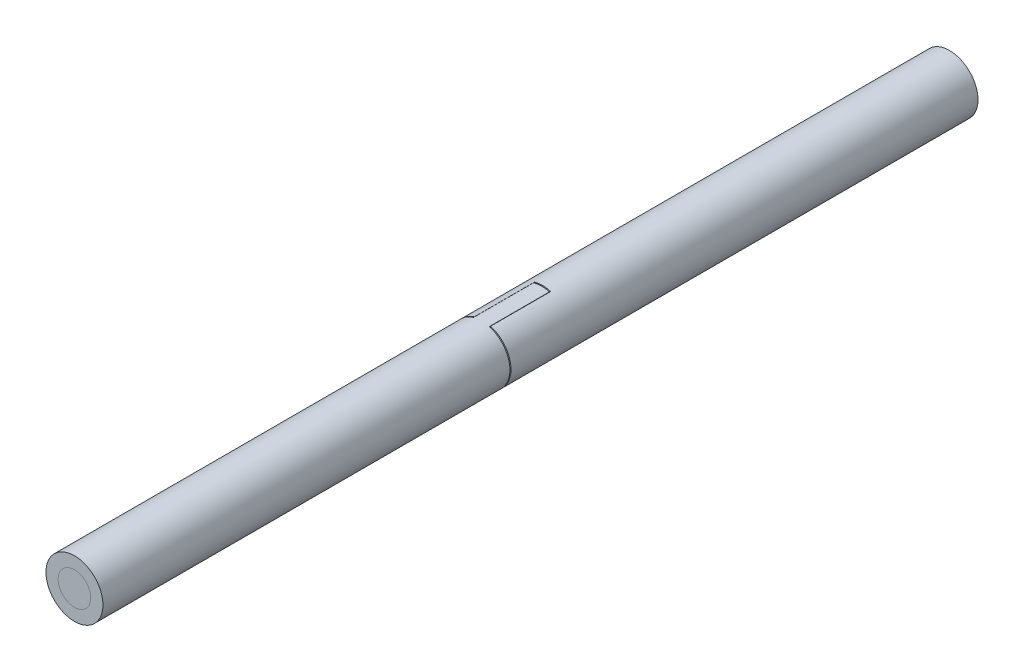
ISO-10303-21;
HEADER;
FILE_DESCRIPTION(('STEP AP214'),'2;1');
FILE_NAME('part.step','',(''),(''),'','','');
FILE_SCHEMA(('AUTOMOTIVE_DESIGN { 1 0 10303 214 1 1 1 1 }'));
ENDSEC;
DATA;
#1=APPLICATION_CONTEXT('core data for automotive mechanical design processes');
#2=APPLICATION_PROTOCOL_DEFINITION('international standard','automotive_design',2000,#1);
#3=PRODUCT_CONTEXT('',#1,'mechanical');
#4=PRODUCT('Part','Part','',(#3));
#5=PRODUCT_RELATED_PRODUCT_CATEGORY('part','',(#4));
#6=PRODUCT_DEFINITION_FORMATION('','',#4);
#7=PRODUCT_DEFINITION_CONTEXT('part definition',#1,'design');
#8=PRODUCT_DEFINITION('design','',#6,#7);
#9=PRODUCT_DEFINITION_SHAPE('','',#8);
#10=(LENGTH_UNIT() NAMED_UNIT(*) SI_UNIT(.MILLI.,.METRE.));
#11=(NAMED_UNIT(*) PLANE_ANGLE_UNIT() SI_UNIT($,.RADIAN.));
#12=(NAMED_UNIT(*) SI_UNIT($,.STERADIAN.) SOLID_ANGLE_UNIT());
#13=UNCERTAINTY_MEASURE_WITH_UNIT(LENGTH_MEASURE(1.E-05),#10,'distance_accuracy_value','');
#14=(GEOMETRIC_REPRESENTATION_CONTEXT(3) GLOBAL_UNCERTAINTY_ASSIGNED_CONTEXT((#13)) GLOBAL_UNIT_ASSIGNED_CONTEXT((#10,
#11,#12)) REPRESENTATION_CONTEXT('',''));
#15=CARTESIAN_POINT('',(0.,0.,0.));
#16=DIRECTION('',(0.,0.,1.));
#17=DIRECTION('',(1.,0.,0.));
#18=AXIS2_PLACEMENT_3D('',#15,#16,#17);
#19=CARTESIAN_POINT('',(0.,0.,107.5));
#20=DIRECTION('',(0.,0.,-1.));
#21=DIRECTION('',(-1.,0.,0.));
#22=AXIS2_PLACEMENT_3D('',#19,#20,#21);
#23=CYLINDRICAL_SURFACE('',#22,4.);
#24=CARTESIAN_POINT('',(0.,0.,107.5));
#25=DIRECTION('',(0.,0.,1.));
#26=DIRECTION('',(1.,0.,0.));
#27=AXIS2_PLACEMENT_3D('',#24,#25,#26);
#28=CIRCLE('',#27,4.);
#29=CARTESIAN_POINT('',(4.,0.,107.5));
#30=VERTEX_POINT('',#29);
#31=EDGE_CURVE('E12',#30,#30,#28,.T.);
#32=ORIENTED_EDGE('',*,*,#31,.F.);
#33=EDGE_LOOP('',(#32));
#34=FACE_BOUND('',#33,.T.);
#35=CARTESIAN_POINT('',(0.,0.,7.5));
#36=DIRECTION('',(0.,0.,1.));
#37=DIRECTION('',(1.,0.,0.));
#38=AXIS2_PLACEMENT_3D('',#35,#36,#37);
#39=CIRCLE('',#38,4.);
#40=CARTESIAN_POINT('',(2.,3.46410161513775,7.5));
#41=VERTEX_POINT('',#40);
#42=CARTESIAN_POINT('',(-2.,3.46410161513775,7.5));
#43=VERTEX_POINT('',#42);
#44=EDGE_CURVE('E61',#41,#43,#39,.T.);
#45=ORIENTED_EDGE('',*,*,#44,.T.);
#46=DIRECTION('',(0.,0.,1.));
#47=VECTOR('',#46,1.);
#48=CARTESIAN_POINT('',(-2.,3.46410161513775,-7.25));
#49=LINE('',#48,#47);
#50=CARTESIAN_POINT('',(-2.,3.46410161513775,-7.25));
#51=VERTEX_POINT('',#50);
#52=EDGE_CURVE('E72',#51,#43,#49,.T.);
#53=ORIENTED_EDGE('',*,*,#52,.F.);
#54=CARTESIAN_POINT('',(0.,0.,-7.25));
#55=DIRECTION('',(0.,0.,1.));
#56=DIRECTION('',(1.,0.,0.));
#57=AXIS2_PLACEMENT_3D('',#54,#55,#56);
#58=CIRCLE('',#57,4.);
#59=CARTESIAN_POINT('',(-2.,-3.46410161513775,-7.25));
#60=VERTEX_POINT('',#59);
#61=EDGE_CURVE('E100',#51,#60,#58,.T.);
#62=ORIENTED_EDGE('',*,*,#61,.T.);
#63=DIRECTION('',(0.,0.,1.));
#64=VECTOR('',#63,1.);
#65=CARTESIAN_POINT('',(-2.,-3.46410161513775,-7.25));
#66=LINE('',#65,#64);
#67=CARTESIAN_POINT('',(-2.,-3.46410161513775,7.5));
#68=VERTEX_POINT('',#67);
#69=EDGE_CURVE('E97',#60,#68,#66,.T.);
#70=ORIENTED_EDGE('',*,*,#69,.T.);
#71=CARTESIAN_POINT('',(2.,-3.46410161513775,7.5));
#72=VERTEX_POINT('',#71);
#73=EDGE_CURVE('E80',#68,#72,#39,.T.);
#74=ORIENTED_EDGE('',*,*,#73,.T.);
#75=DIRECTION('',(0.,0.,1.));
#76=VECTOR('',#75,1.);
#77=CARTESIAN_POINT('',(2.,-3.46410161513775,-7.25));
#78=LINE('',#77,#76);
#79=CARTESIAN_POINT('',(2.,-3.46410161513775,-7.25));
#80=VERTEX_POINT('',#79);
#81=EDGE_CURVE('E113',#80,#72,#78,.T.);
#82=ORIENTED_EDGE('',*,*,#81,.F.);
#83=CARTESIAN_POINT('',(0.,0.,-7.25));
#84=DIRECTION('',(0.,0.,1.));
#85=DIRECTION('',(1.,0.,0.));
#86=AXIS2_PLACEMENT_3D('',#83,#84,#85);
#87=CIRCLE('',#86,4.);
#88=CARTESIAN_POINT('',(2.,3.46410161513775,-7.25));
#89=VERTEX_POINT('',#88);
#90=EDGE_CURVE('E122',#80,#89,#87,.T.);
#91=ORIENTED_EDGE('',*,*,#90,.T.);
#92=DIRECTION('',(0.,0.,1.));
#93=VECTOR('',#92,1.);
#94=CARTESIAN_POINT('',(2.,3.46410161513775,-7.25));
#95=LINE('',#94,#93);
#96=EDGE_CURVE('E114',#89,#41,#95,.T.);
#97=ORIENTED_EDGE('',*,*,#96,.T.);
#98=EDGE_LOOP('',(#45,#53,#62,#70,#74,#82,#91,#97));
#99=FACE_BOUND('',#98,.T.);
#100=ADVANCED_FACE('F58',(#34,#99),#23,.T.);
#101=CARTESIAN_POINT('',(0.,0.,107.5));
#102=DIRECTION('',(0.,0.,1.));
#103=DIRECTION('',(1.,0.,0.));
#104=AXIS2_PLACEMENT_3D('',#101,#102,#103);
#105=PLANE('',#104);
#106=ORIENTED_EDGE('',*,*,#31,.T.);
#107=EDGE_LOOP('',(#106));
#108=FACE_BOUND('',#107,.T.);
#109=ADVANCED_FACE('F139',(#108),#105,.T.);
#110=CARTESIAN_POINT('',(0.,0.,7.5));
#111=DIRECTION('',(0.,0.,1.));
#112=DIRECTION('',(1.,0.,0.));
#113=AXIS2_PLACEMENT_3D('',#110,#111,#112);
#114=PLANE('',#113);
#115=ORIENTED_EDGE('',*,*,#73,.F.);
#116=DIRECTION('',(0.,1.,0.));
#117=VECTOR('',#116,1.);
#118=CARTESIAN_POINT('',(-2.,-3.46410161513775,7.5));
#119=LINE('',#118,#117);
#120=EDGE_CURVE('E104',#68,#43,#119,.T.);
#121=ORIENTED_EDGE('',*,*,#120,.T.);
#122=ORIENTED_EDGE('',*,*,#44,.F.);
#123=DIRECTION('',(0.,-1.,0.));
#124=VECTOR('',#123,1.);
#125=CARTESIAN_POINT('',(2.,3.46410161513775,7.5));
#126=LINE('',#125,#124);
#127=EDGE_CURVE('E108',#41,#72,#126,.T.);
#128=ORIENTED_EDGE('',*,*,#127,.T.);
#129=EDGE_LOOP('',(#115,#121,#122,#128));
#130=FACE_BOUND('',#129,.T.);
#131=ADVANCED_FACE('F111',(#130),#114,.F.);
#132=CARTESIAN_POINT('',(2.,3.46410161513775,-7.25));
#133=DIRECTION('',(-1.,0.,0.));
#134=DIRECTION('',(0.,0.,1.));
#135=AXIS2_PLACEMENT_3D('',#132,#133,#134);
#136=PLANE('',#135);
#137=ORIENTED_EDGE('',*,*,#127,.F.);
#138=ORIENTED_EDGE('',*,*,#96,.F.);
#139=DIRECTION('',(0.,-1.,0.));
#140=VECTOR('',#139,1.);
#141=CARTESIAN_POINT('',(2.,3.46410161513775,-7.25));
#142=LINE('',#141,#140);
#143=EDGE_CURVE('E118',#89,#80,#142,.T.);
#144=ORIENTED_EDGE('',*,*,#143,.T.);
#145=ORIENTED_EDGE('',*,*,#81,.T.);
#146=EDGE_LOOP('',(#137,#138,#144,#145));
#147=FACE_BOUND('',#146,.T.);
#148=ADVANCED_FACE('F150',(#147),#136,.T.);
#149=CARTESIAN_POINT('',(0.,0.,-7.25));
#150=DIRECTION('',(0.,0.,1.));
#151=DIRECTION('',(1.,0.,0.));
#152=AXIS2_PLACEMENT_3D('',#149,#150,#151);
#153=PLANE('',#152);
#154=ORIENTED_EDGE('',*,*,#90,.F.);
#155=ORIENTED_EDGE('',*,*,#143,.F.);
#156=EDGE_LOOP('',(#154,#155));
#157=FACE_BOUND('',#156,.T.);
#158=ADVANCED_FACE('F135',(#157),#153,.F.);
#159=CARTESIAN_POINT('',(-2.,-3.46410161513775,-7.25));
#160=DIRECTION('',(1.,0.,0.));
#161=DIRECTION('',(0.,0.,-1.));
#162=AXIS2_PLACEMENT_3D('',#159,#160,#161);
#163=PLANE('',#162);
#164=ORIENTED_EDGE('',*,*,#120,.F.);
#165=ORIENTED_EDGE('',*,*,#69,.F.);
#166=DIRECTION('',(0.,1.,0.));
#167=VECTOR('',#166,1.);
#168=CARTESIAN_POINT('',(-2.,-3.46410161513775,-7.25));
#169=LINE('',#168,#167);
#170=EDGE_CURVE('E102',#60,#51,#169,.T.);
#171=ORIENTED_EDGE('',*,*,#170,.T.);
#172=ORIENTED_EDGE('',*,*,#52,.T.);
#173=EDGE_LOOP('',(#164,#165,#171,#172));
#174=FACE_BOUND('',#173,.T.);
#175=ADVANCED_FACE('F105',(#174),#163,.T.);
#176=CARTESIAN_POINT('',(0.,0.,-7.25));
#177=DIRECTION('',(0.,0.,1.));
#178=DIRECTION('',(1.,0.,0.));
#179=AXIS2_PLACEMENT_3D('',#176,#177,#178);
#180=PLANE('',#179);
#181=ORIENTED_EDGE('',*,*,#61,.F.);
#182=ORIENTED_EDGE('',*,*,#170,.F.);
#183=EDGE_LOOP('',(#181,#182));
#184=FACE_BOUND('',#183,.T.);
#185=ADVANCED_FACE('F129',(#184),#180,.F.);
#186=CLOSED_SHELL('',(#100,#109,#131,#148,#158,#175,#185));
#187=MANIFOLD_SOLID_BREP('B2',#186);
#188=CARTESIAN_POINT('',(0.,0.,-7.5));
#189=DIRECTION('',(0.,0.,1.));
#190=DIRECTION('',(1.,0.,0.));
#191=AXIS2_PLACEMENT_3D('',#188,#189,#190);
#192=PLANE('',#191);
#193=DIRECTION('',(0.,1.,0.));
#194=VECTOR('',#193,1.);
#195=CARTESIAN_POINT('',(1.95,3.49249194702006,-7.5));
#196=LINE('',#195,#194);
#197=CARTESIAN_POINT('',(1.95,-3.49249194702006,-7.5));
#198=VERTEX_POINT('',#197);
#199=CARTESIAN_POINT('',(1.95,3.49249194702006,-7.5));
#200=VERTEX_POINT('',#199);
#201=EDGE_CURVE('E228',#198,#200,#196,.T.);
#202=ORIENTED_EDGE('',*,*,#201,.F.);
#203=CARTESIAN_POINT('',(0.,0.,-7.5));
#204=DIRECTION('',(0.,0.,1.));
#205=DIRECTION('',(1.,0.,0.));
#206=AXIS2_PLACEMENT_3D('',#203,#204,#205);
#207=CIRCLE('',#206,4.);
#208=EDGE_CURVE('E216',#198,#200,#207,.T.);
#209=ORIENTED_EDGE('',*,*,#208,.T.);
#210=EDGE_LOOP('',(#202,#209));
#211=FACE_BOUND('',#210,.T.);
#212=ADVANCED_FACE('F212',(#211),#192,.T.);
#213=CARTESIAN_POINT('',(0.,0.,-107.5));
#214=DIRECTION('',(0.,0.,1.));
#215=DIRECTION('',(1.,0.,0.));
#216=AXIS2_PLACEMENT_3D('',#213,#214,#215);
#217=CYLINDRICAL_SURFACE('',#216,4.);
#218=CARTESIAN_POINT('',(0.,0.,-107.5));
#219=DIRECTION('',(0.,0.,1.));
#220=DIRECTION('',(1.,0.,0.));
#221=AXIS2_PLACEMENT_3D('',#218,#219,#220);
#222=CIRCLE('',#221,4.);
#223=CARTESIAN_POINT('',(4.,0.,-107.5));
#224=VERTEX_POINT('',#223);
#225=EDGE_CURVE('E56',#224,#224,#222,.T.);
#226=ORIENTED_EDGE('',*,*,#225,.T.);
#227=EDGE_LOOP('',(#226));
#228=FACE_BOUND('',#227,.T.);
#229=CARTESIAN_POINT('',(-1.95,3.49249194702006,-7.5));
#230=VERTEX_POINT('',#229);
#231=CARTESIAN_POINT('',(-1.95,-3.49249194702007,-7.5));
#232=VERTEX_POINT('',#231);
#233=EDGE_CURVE('E222',#230,#232,#207,.T.);
#234=ORIENTED_EDGE('',*,*,#233,.F.);
#235=DIRECTION('',(0.,0.,-1.));
#236=VECTOR('',#235,1.);
#237=CARTESIAN_POINT('',(-1.95,3.49249194702007,7.25));
#238=LINE('',#237,#236);
#239=CARTESIAN_POINT('',(-1.95,3.49249194702007,7.25));
#240=VERTEX_POINT('',#239);
#241=EDGE_CURVE('E259',#240,#230,#238,.T.);
#242=ORIENTED_EDGE('',*,*,#241,.F.);
#243=CARTESIAN_POINT('',(0.,0.,7.25));
#244=DIRECTION('',(0.,0.,1.));
#245=DIRECTION('',(1.,0.,0.));
#246=AXIS2_PLACEMENT_3D('',#243,#244,#245);
#247=CIRCLE('',#246,4.);
#248=CARTESIAN_POINT('',(1.95,3.49249194702006,7.25));
#249=VERTEX_POINT('',#248);
#250=EDGE_CURVE('E266',#249,#240,#247,.T.);
#251=ORIENTED_EDGE('',*,*,#250,.F.);
#252=DIRECTION('',(0.,0.,-1.));
#253=VECTOR('',#252,1.);
#254=CARTESIAN_POINT('',(1.95,3.49249194702006,7.25));
#255=LINE('',#254,#253);
#256=EDGE_CURVE('E287',#249,#200,#255,.T.);
#257=ORIENTED_EDGE('',*,*,#256,.T.);
#258=ORIENTED_EDGE('',*,*,#208,.F.);
#259=DIRECTION('',(0.,0.,-1.));
#260=VECTOR('',#259,1.);
#261=CARTESIAN_POINT('',(1.95,-3.49249194702007,7.25));
#262=LINE('',#261,#260);
#263=CARTESIAN_POINT('',(1.95,-3.49249194702007,7.25));
#264=VERTEX_POINT('',#263);
#265=EDGE_CURVE('E281',#264,#198,#262,.T.);
#266=ORIENTED_EDGE('',*,*,#265,.F.);
#267=CARTESIAN_POINT('',(0.,0.,7.25));
#268=DIRECTION('',(0.,0.,1.));
#269=DIRECTION('',(1.,0.,0.));
#270=AXIS2_PLACEMENT_3D('',#267,#268,#269);
#271=CIRCLE('',#270,4.);
#272=CARTESIAN_POINT('',(-1.95,-3.49249194702007,7.25));
#273=VERTEX_POINT('',#272);
#274=EDGE_CURVE('E265',#273,#264,#271,.T.);
#275=ORIENTED_EDGE('',*,*,#274,.F.);
#276=DIRECTION('',(0.,0.,-1.));
#277=VECTOR('',#276,1.);
#278=CARTESIAN_POINT('',(-1.95,-3.49249194702007,7.25));
#279=LINE('',#278,#277);
#280=EDGE_CURVE('E261',#273,#232,#279,.T.);
#281=ORIENTED_EDGE('',*,*,#280,.T.);
#282=EDGE_LOOP('',(#234,#242,#251,#257,#258,#266,#275,#281));
#283=FACE_BOUND('',#282,.T.);
#284=ADVANCED_FACE('F214',(#228,#283),#217,.T.);
#285=CARTESIAN_POINT('',(0.,0.,-107.5));
#286=DIRECTION('',(0.,0.,1.));
#287=DIRECTION('',(1.,0.,0.));
#288=AXIS2_PLACEMENT_3D('',#285,#286,#287);
#289=PLANE('',#288);
#290=ORIENTED_EDGE('',*,*,#225,.F.);
#291=EDGE_LOOP('',(#290));
#292=FACE_BOUND('',#291,.T.);
#293=ADVANCED_FACE('F314',(#292),#289,.F.);
#294=DIRECTION('',(0.,-1.,0.));
#295=VECTOR('',#294,1.);
#296=CARTESIAN_POINT('',(-1.95,3.49249194702007,-7.5));
#297=LINE('',#296,#295);
#298=EDGE_CURVE('E235',#230,#232,#297,.T.);
#299=ORIENTED_EDGE('',*,*,#298,.F.);
#300=ORIENTED_EDGE('',*,*,#233,.T.);
#301=EDGE_LOOP('',(#299,#300));
#302=FACE_BOUND('',#301,.T.);
#303=ADVANCED_FACE('F307',(#302),#192,.T.);
#304=CARTESIAN_POINT('',(-1.95,3.49249194702007,7.25));
#305=DIRECTION('',(1.,0.,0.));
#306=DIRECTION('',(0.,0.,-1.));
#307=AXIS2_PLACEMENT_3D('',#304,#305,#306);
#308=PLANE('',#307);
#309=ORIENTED_EDGE('',*,*,#298,.T.);
#310=ORIENTED_EDGE('',*,*,#280,.F.);
#311=DIRECTION('',(0.,-1.,0.));
#312=VECTOR('',#311,1.);
#313=CARTESIAN_POINT('',(-1.95,3.49249194702007,7.25));
#314=LINE('',#313,#312);
#315=EDGE_CURVE('E255',#240,#273,#314,.T.);
#316=ORIENTED_EDGE('',*,*,#315,.F.);
#317=ORIENTED_EDGE('',*,*,#241,.T.);
#318=EDGE_LOOP('',(#309,#310,#316,#317));
#319=FACE_BOUND('',#318,.T.);
#320=ADVANCED_FACE('F257',(#319),#308,.F.);
#321=CARTESIAN_POINT('',(1.95,3.49249194702006,7.25));
#322=DIRECTION('',(-1.,0.,0.));
#323=DIRECTION('',(0.,0.,1.));
#324=AXIS2_PLACEMENT_3D('',#321,#322,#323);
#325=PLANE('',#324);
#326=ORIENTED_EDGE('',*,*,#201,.T.);
#327=ORIENTED_EDGE('',*,*,#256,.F.);
#328=DIRECTION('',(0.,1.,0.));
#329=VECTOR('',#328,1.);
#330=CARTESIAN_POINT('',(1.95,3.49249194702006,7.25));
#331=LINE('',#330,#329);
#332=EDGE_CURVE('E271',#264,#249,#331,.T.);
#333=ORIENTED_EDGE('',*,*,#332,.F.);
#334=ORIENTED_EDGE('',*,*,#265,.T.);
#335=EDGE_LOOP('',(#326,#327,#333,#334));
#336=FACE_BOUND('',#335,.T.);
#337=ADVANCED_FACE('F299',(#336),#325,.F.);
#338=CARTESIAN_POINT('',(0.,0.,7.25));
#339=DIRECTION('',(0.,0.,1.));
#340=DIRECTION('',(1.,0.,0.));
#341=AXIS2_PLACEMENT_3D('',#338,#339,#340);
#342=PLANE('',#341);
#343=ORIENTED_EDGE('',*,*,#250,.T.);
#344=ORIENTED_EDGE('',*,*,#315,.T.);
#345=ORIENTED_EDGE('',*,*,#274,.T.);
#346=ORIENTED_EDGE('',*,*,#332,.T.);
#347=EDGE_LOOP('',(#343,#344,#345,#346));
#348=FACE_BOUND('',#347,.T.);
#349=ADVANCED_FACE('F269',(#348),#342,.T.);
#350=CLOSED_SHELL('',(#212,#284,#293,#303,#320,#337,#349));
#351=MANIFOLD_SOLID_BREP('B6',#350);
#352=CARTESIAN_POINT('',(0.,0.,7.5));
#353=DIRECTION('',(0.,0.,1.));
#354=DIRECTION('',(1.,0.,0.));
#355=AXIS2_PLACEMENT_3D('',#352,#353,#354);
#356=PLANE('',#355);
#357=CARTESIAN_POINT('',(0.,0.,7.5));
#358=DIRECTION('',(0.,0.,1.));
#359=DIRECTION('',(1.,0.,0.));
#360=AXIS2_PLACEMENT_3D('',#357,#358,#359);
#361=CIRCLE('',#360,4.);
#362=CARTESIAN_POINT('',(-1.95,3.49249194702006,7.5));
#363=VERTEX_POINT('',#362);
#364=CARTESIAN_POINT('',(-1.95,-3.49249194702006,7.5));
#365=VERTEX_POINT('',#364);
#366=EDGE_CURVE('E452',#363,#365,#361,.T.);
#367=ORIENTED_EDGE('',*,*,#366,.T.);
#368=DIRECTION('',(0.,-1.,0.));
#369=VECTOR('',#368,1.);
#370=CARTESIAN_POINT('',(-1.95,-3.49249194702006,7.5));
#371=LINE('',#370,#369);
#372=CARTESIAN_POINT('',(-1.95,-6.72290859673103,7.5));
#373=VERTEX_POINT('',#372);
#374=EDGE_CURVE('E399',#365,#373,#371,.T.);
#375=ORIENTED_EDGE('',*,*,#374,.T.);
#376=CARTESIAN_POINT('',(0.,0.,7.5));
#377=DIRECTION('',(0.,0.,1.));
#378=DIRECTION('',(1.,0.,0.));
#379=AXIS2_PLACEMENT_3D('',#376,#377,#378);
#380=CIRCLE('',#379,7.);
#381=CARTESIAN_POINT('',(-1.95,6.72290859673103,7.5));
#382=VERTEX_POINT('',#381);
#383=EDGE_CURVE('E380',#382,#373,#380,.T.);
#384=ORIENTED_EDGE('',*,*,#383,.F.);
#385=DIRECTION('',(0.,-1.,0.));
#386=VECTOR('',#385,1.);
#387=CARTESIAN_POINT('',(-1.95,6.72290859673103,7.5));
#388=LINE('',#387,#386);
#389=EDGE_CURVE('E459',#382,#363,#388,.T.);
#390=ORIENTED_EDGE('',*,*,#389,.T.);
#391=EDGE_LOOP('',(#367,#375,#384,#390));
#392=FACE_BOUND('',#391,.T.);
#393=ADVANCED_FACE('F376',(#392),#356,.F.);
#394=CARTESIAN_POINT('',(0.,0.,107.5));
#395=DIRECTION('',(0.,0.,1.));
#396=DIRECTION('',(1.,0.,0.));
#397=AXIS2_PLACEMENT_3D('',#394,#395,#396);
#398=PLANE('',#397);
#399=CARTESIAN_POINT('',(0.,0.,107.5));
#400=DIRECTION('',(0.,0.,1.));
#401=DIRECTION('',(1.,0.,0.));
#402=AXIS2_PLACEMENT_3D('',#399,#400,#401);
#403=CIRCLE('',#402,7.);
#404=CARTESIAN_POINT('',(7.,0.,107.5));
#405=VERTEX_POINT('',#404);
#406=EDGE_CURVE('E210',#405,#405,#403,.T.);
#407=ORIENTED_EDGE('',*,*,#406,.T.);
#408=EDGE_LOOP('',(#407));
#409=FACE_BOUND('',#408,.T.);
#410=CARTESIAN_POINT('',(0.,0.,107.5));
#411=DIRECTION('',(0.,0.,1.));
#412=DIRECTION('',(1.,0.,0.));
#413=AXIS2_PLACEMENT_3D('',#410,#411,#412);
#414=CIRCLE('',#413,4.);
#415=CARTESIAN_POINT('',(4.,0.,107.5));
#416=VERTEX_POINT('',#415);
#417=EDGE_CURVE('E507',#416,#416,#414,.T.);
#418=ORIENTED_EDGE('',*,*,#417,.F.);
#419=EDGE_LOOP('',(#418));
#420=FACE_BOUND('',#419,.T.);
#421=ADVANCED_FACE('F526',(#409,#420),#398,.T.);
#422=CARTESIAN_POINT('',(1.95,-6.72290859673103,7.5));
#423=VERTEX_POINT('',#422);
#424=CARTESIAN_POINT('',(1.95,6.72290859673103,7.5));
#425=VERTEX_POINT('',#424);
#426=EDGE_CURVE('E391',#423,#425,#380,.T.);
#427=ORIENTED_EDGE('',*,*,#426,.F.);
#428=DIRECTION('',(0.,1.,0.));
#429=VECTOR('',#428,1.);
#430=CARTESIAN_POINT('',(1.95,-3.49249194702006,7.5));
#431=LINE('',#430,#429);
#432=CARTESIAN_POINT('',(1.95,-3.49249194702006,7.5));
#433=VERTEX_POINT('',#432);
#434=EDGE_CURVE('E456',#423,#433,#431,.T.);
#435=ORIENTED_EDGE('',*,*,#434,.T.);
#436=CARTESIAN_POINT('',(1.95,3.49249194702006,7.5));
#437=VERTEX_POINT('',#436);
#438=EDGE_CURVE('E442',#433,#437,#361,.T.);
#439=ORIENTED_EDGE('',*,*,#438,.T.);
#440=DIRECTION('',(0.,1.,0.));
#441=VECTOR('',#440,1.);
#442=CARTESIAN_POINT('',(1.95,6.72290859673103,7.5));
#443=LINE('',#442,#441);
#444=EDGE_CURVE('E489',#437,#425,#443,.T.);
#445=ORIENTED_EDGE('',*,*,#444,.T.);
#446=EDGE_LOOP('',(#427,#435,#439,#445));
#447=FACE_BOUND('',#446,.T.);
#448=ADVANCED_FACE('F457',(#447),#356,.F.);
#449=CARTESIAN_POINT('',(0.,0.,107.5));
#450=DIRECTION('',(0.,0.,-1.));
#451=DIRECTION('',(-1.,0.,0.));
#452=AXIS2_PLACEMENT_3D('',#449,#450,#451);
#453=CYLINDRICAL_SURFACE('',#452,7.);
#454=ORIENTED_EDGE('',*,*,#406,.F.);
#455=EDGE_LOOP('',(#454));
#456=FACE_BOUND('',#455,.T.);
#457=ORIENTED_EDGE('',*,*,#383,.T.);
#458=DIRECTION('',(0.,0.,1.));
#459=VECTOR('',#458,1.);
#460=CARTESIAN_POINT('',(-1.95,-6.72290859673103,-7.25));
#461=LINE('',#460,#459);
#462=CARTESIAN_POINT('',(-1.95,-6.72290859673103,-7.25));
#463=VERTEX_POINT('',#462);
#464=EDGE_CURVE('E471',#463,#373,#461,.T.);
#465=ORIENTED_EDGE('',*,*,#464,.F.);
#466=CARTESIAN_POINT('',(0.,0.,-7.25));
#467=DIRECTION('',(0.,0.,1.));
#468=DIRECTION('',(1.,0.,0.));
#469=AXIS2_PLACEMENT_3D('',#466,#467,#468);
#470=CIRCLE('',#469,7.);
#471=CARTESIAN_POINT('',(1.95,-6.72290859673103,-7.25));
#472=VERTEX_POINT('',#471);
#473=EDGE_CURVE('E476',#463,#472,#470,.T.);
#474=ORIENTED_EDGE('',*,*,#473,.T.);
#475=DIRECTION('',(0.,0.,1.));
#476=VECTOR('',#475,1.);
#477=CARTESIAN_POINT('',(1.95,-6.72290859673103,-7.25));
#478=LINE('',#477,#476);
#479=EDGE_CURVE('E465',#472,#423,#478,.T.);
#480=ORIENTED_EDGE('',*,*,#479,.T.);
#481=ORIENTED_EDGE('',*,*,#426,.T.);
#482=DIRECTION('',(0.,0.,1.));
#483=VECTOR('',#482,1.);
#484=CARTESIAN_POINT('',(1.95,6.72290859673103,-7.25));
#485=LINE('',#484,#483);
#486=CARTESIAN_POINT('',(1.95,6.72290859673103,-7.25));
#487=VERTEX_POINT('',#486);
#488=EDGE_CURVE('E453',#487,#425,#485,.T.);
#489=ORIENTED_EDGE('',*,*,#488,.F.);
#490=CARTESIAN_POINT('',(0.,0.,-7.25));
#491=DIRECTION('',(0.,0.,1.));
#492=DIRECTION('',(1.,0.,0.));
#493=AXIS2_PLACEMENT_3D('',#490,#491,#492);
#494=CIRCLE('',#493,7.);
#495=CARTESIAN_POINT('',(-1.95,6.72290859673103,-7.25));
#496=VERTEX_POINT('',#495);
#497=EDGE_CURVE('E485',#487,#496,#494,.T.);
#498=ORIENTED_EDGE('',*,*,#497,.T.);
#499=DIRECTION('',(0.,0.,1.));
#500=VECTOR('',#499,1.);
#501=CARTESIAN_POINT('',(-1.95,6.72290859673103,-7.25));
#502=LINE('',#501,#500);
#503=EDGE_CURVE('E497',#496,#382,#502,.T.);
#504=ORIENTED_EDGE('',*,*,#503,.T.);
#505=EDGE_LOOP('',(#457,#465,#474,#480,#481,#489,#498,#504));
#506=FACE_BOUND('',#505,.T.);
#507=ADVANCED_FACE('F378',(#456,#506),#453,.T.);
#508=CARTESIAN_POINT('',(0.,0.,107.5));
#509=DIRECTION('',(0.,0.,-1.));
#510=DIRECTION('',(-1.,0.,0.));
#511=AXIS2_PLACEMENT_3D('',#508,#509,#510);
#512=CYLINDRICAL_SURFACE('',#511,4.);
#513=ORIENTED_EDGE('',*,*,#417,.T.);
#514=EDGE_LOOP('',(#513));
#515=FACE_BOUND('',#514,.T.);
#516=ORIENTED_EDGE('',*,*,#366,.F.);
#517=DIRECTION('',(0.,0.,1.));
#518=VECTOR('',#517,1.);
#519=CARTESIAN_POINT('',(-1.95,3.49249194702006,-7.25));
#520=LINE('',#519,#518);
#521=CARTESIAN_POINT('',(-1.95,3.49249194702006,-7.25));
#522=VERTEX_POINT('',#521);
#523=EDGE_CURVE('E504',#522,#363,#520,.T.);
#524=ORIENTED_EDGE('',*,*,#523,.F.);
#525=CARTESIAN_POINT('',(0.,0.,-7.25));
#526=DIRECTION('',(0.,0.,-1.));
#527=DIRECTION('',(1.,0.,0.));
#528=AXIS2_PLACEMENT_3D('',#525,#526,#527);
#529=CIRCLE('',#528,4.);
#530=CARTESIAN_POINT('',(1.95,3.49249194702006,-7.25));
#531=VERTEX_POINT('',#530);
#532=EDGE_CURVE('E492',#522,#531,#529,.T.);
#533=ORIENTED_EDGE('',*,*,#532,.T.);
#534=DIRECTION('',(0.,0.,1.));
#535=VECTOR('',#534,1.);
#536=CARTESIAN_POINT('',(1.95,3.49249194702006,-7.25));
#537=LINE('',#536,#535);
#538=EDGE_CURVE('E450',#531,#437,#537,.T.);
#539=ORIENTED_EDGE('',*,*,#538,.T.);
#540=ORIENTED_EDGE('',*,*,#438,.F.);
#541=DIRECTION('',(0.,0.,1.));
#542=VECTOR('',#541,1.);
#543=CARTESIAN_POINT('',(1.95,-3.49249194702006,-7.25));
#544=LINE('',#543,#542);
#545=CARTESIAN_POINT('',(1.95,-3.49249194702006,-7.25));
#546=VERTEX_POINT('',#545);
#547=EDGE_CURVE('E447',#546,#433,#544,.T.);
#548=ORIENTED_EDGE('',*,*,#547,.F.);
#549=CARTESIAN_POINT('',(0.,0.,-7.25));
#550=DIRECTION('',(0.,0.,-1.));
#551=DIRECTION('',(1.,0.,0.));
#552=AXIS2_PLACEMENT_3D('',#549,#550,#551);
#553=CIRCLE('',#552,4.);
#554=CARTESIAN_POINT('',(-1.95,-3.49249194702006,-7.25));
#555=VERTEX_POINT('',#554);
#556=EDGE_CURVE('E480',#546,#555,#553,.T.);
#557=ORIENTED_EDGE('',*,*,#556,.T.);
#558=DIRECTION('',(0.,0.,1.));
#559=VECTOR('',#558,1.);
#560=CARTESIAN_POINT('',(-1.95,-3.49249194702006,-7.25));
#561=LINE('',#560,#559);
#562=EDGE_CURVE('E466',#555,#365,#561,.T.);
#563=ORIENTED_EDGE('',*,*,#562,.T.);
#564=EDGE_LOOP('',(#516,#524,#533,#539,#540,#548,#557,#563));
#565=FACE_BOUND('',#564,.T.);
#566=ADVANCED_FACE('F444',(#515,#565),#512,.F.);
#567=CARTESIAN_POINT('',(1.95,6.72290859673103,-7.25));
#568=DIRECTION('',(1.,0.,0.));
#569=DIRECTION('',(0.,0.,-1.));
#570=AXIS2_PLACEMENT_3D('',#567,#568,#569);
#571=PLANE('',#570);
#572=ORIENTED_EDGE('',*,*,#444,.F.);
#573=ORIENTED_EDGE('',*,*,#538,.F.);
#574=DIRECTION('',(0.,1.,0.));
#575=VECTOR('',#574,1.);
#576=CARTESIAN_POINT('',(1.95,6.72290859673103,-7.25));
#577=LINE('',#576,#575);
#578=EDGE_CURVE('E494',#531,#487,#577,.T.);
#579=ORIENTED_EDGE('',*,*,#578,.T.);
#580=ORIENTED_EDGE('',*,*,#488,.T.);
#581=EDGE_LOOP('',(#572,#573,#579,#580));
#582=FACE_BOUND('',#581,.T.);
#583=ADVANCED_FACE('F540',(#582),#571,.T.);
#584=CARTESIAN_POINT('',(-1.95,6.72290859673103,-7.25));
#585=DIRECTION('',(-1.,0.,0.));
#586=DIRECTION('',(0.,0.,1.));
#587=AXIS2_PLACEMENT_3D('',#584,#585,#586);
#588=PLANE('',#587);
#589=ORIENTED_EDGE('',*,*,#389,.F.);
#590=ORIENTED_EDGE('',*,*,#503,.F.);
#591=DIRECTION('',(0.,-1.,0.));
#592=VECTOR('',#591,1.);
#593=CARTESIAN_POINT('',(-1.95,6.72290859673103,-7.25));
#594=LINE('',#593,#592);
#595=EDGE_CURVE('E488',#496,#522,#594,.T.);
#596=ORIENTED_EDGE('',*,*,#595,.T.);
#597=ORIENTED_EDGE('',*,*,#523,.T.);
#598=EDGE_LOOP('',(#589,#590,#596,#597));
#599=FACE_BOUND('',#598,.T.);
#600=ADVANCED_FACE('F549',(#599),#588,.T.);
#601=CARTESIAN_POINT('',(0.,0.,-7.25));
#602=DIRECTION('',(0.,0.,1.));
#603=DIRECTION('',(1.,0.,0.));
#604=AXIS2_PLACEMENT_3D('',#601,#602,#603);
#605=PLANE('',#604);
#606=ORIENTED_EDGE('',*,*,#497,.F.);
#607=ORIENTED_EDGE('',*,*,#578,.F.);
#608=ORIENTED_EDGE('',*,*,#532,.F.);
#609=ORIENTED_EDGE('',*,*,#595,.F.);
#610=EDGE_LOOP('',(#606,#607,#608,#609));
#611=FACE_BOUND('',#610,.T.);
#612=ADVANCED_FACE('F554',(#611),#605,.F.);
#613=CARTESIAN_POINT('',(-1.95,-3.49249194702006,-7.25));
#614=DIRECTION('',(-1.,0.,0.));
#615=DIRECTION('',(0.,0.,1.));
#616=AXIS2_PLACEMENT_3D('',#613,#614,#615);
#617=PLANE('',#616);
#618=ORIENTED_EDGE('',*,*,#374,.F.);
#619=ORIENTED_EDGE('',*,*,#562,.F.);
#620=DIRECTION('',(0.,-1.,0.));
#621=VECTOR('',#620,1.);
#622=CARTESIAN_POINT('',(-1.95,-3.49249194702006,-7.25));
#623=LINE('',#622,#621);
#624=EDGE_CURVE('E468',#555,#463,#623,.T.);
#625=ORIENTED_EDGE('',*,*,#624,.T.);
#626=ORIENTED_EDGE('',*,*,#464,.T.);
#627=EDGE_LOOP('',(#618,#619,#625,#626));
#628=FACE_BOUND('',#627,.T.);
#629=ADVANCED_FACE('F512',(#628),#617,.T.);
#630=CARTESIAN_POINT('',(1.95,-3.49249194702006,-7.25));
#631=DIRECTION('',(1.,0.,0.));
#632=DIRECTION('',(0.,0.,-1.));
#633=AXIS2_PLACEMENT_3D('',#630,#631,#632);
#634=PLANE('',#633);
#635=ORIENTED_EDGE('',*,*,#434,.F.);
#636=ORIENTED_EDGE('',*,*,#479,.F.);
#637=DIRECTION('',(0.,1.,0.));
#638=VECTOR('',#637,1.);
#639=CARTESIAN_POINT('',(1.95,-3.49249194702006,-7.25));
#640=LINE('',#639,#638);
#641=EDGE_CURVE('E464',#472,#546,#640,.T.);
#642=ORIENTED_EDGE('',*,*,#641,.T.);
#643=ORIENTED_EDGE('',*,*,#547,.T.);
#644=EDGE_LOOP('',(#635,#636,#642,#643));
#645=FACE_BOUND('',#644,.T.);
#646=ADVANCED_FACE('F462',(#645),#634,.T.);
#647=CARTESIAN_POINT('',(0.,0.,-7.25));
#648=DIRECTION('',(0.,0.,1.));
#649=DIRECTION('',(1.,0.,0.));
#650=AXIS2_PLACEMENT_3D('',#647,#648,#649);
#651=PLANE('',#650);
#652=ORIENTED_EDGE('',*,*,#473,.F.);
#653=ORIENTED_EDGE('',*,*,#624,.F.);
#654=ORIENTED_EDGE('',*,*,#556,.F.);
#655=ORIENTED_EDGE('',*,*,#641,.F.);
#656=EDGE_LOOP('',(#652,#653,#654,#655));
#657=FACE_BOUND('',#656,.T.);
#658=ADVANCED_FACE('F516',(#657),#651,.F.);
#659=CLOSED_SHELL('',(#393,#421,#448,#507,#566,#583,#600,#612,#629,#646,#658));
#660=MANIFOLD_SOLID_BREP('B50_NOT_SHOWN',#659);
#661=CARTESIAN_POINT('',(0.,0.,-107.5));
#662=DIRECTION('',(0.,0.,1.));
#663=DIRECTION('',(1.,0.,0.));
#664=AXIS2_PLACEMENT_3D('',#661,#662,#663);
#665=CYLINDRICAL_SURFACE('',#664,7.);
#666=CARTESIAN_POINT('',(0.,0.,-107.5));
#667=DIRECTION('',(0.,0.,1.));
#668=DIRECTION('',(1.,0.,0.));
#669=AXIS2_PLACEMENT_3D('',#666,#667,#668);
#670=CIRCLE('',#669,7.);
#671=CARTESIAN_POINT('',(7.,0.,-107.5));
#672=VERTEX_POINT('',#671);
#673=EDGE_CURVE('E747',#672,#672,#670,.T.);
#674=ORIENTED_EDGE('',*,*,#673,.T.);
#675=EDGE_LOOP('',(#674));
#676=FACE_BOUND('',#675,.T.);
#677=CARTESIAN_POINT('',(0.,0.,7.25));
#678=DIRECTION('',(0.,0.,1.));
#679=DIRECTION('',(1.,0.,0.));
#680=AXIS2_PLACEMENT_3D('',#677,#678,#679);
#681=CIRCLE('',#680,7.);
#682=CARTESIAN_POINT('',(2.,-6.70820393249937,7.25));
#683=VERTEX_POINT('',#682);
#684=CARTESIAN_POINT('',(2.,6.70820393249937,7.25));
#685=VERTEX_POINT('',#684);
#686=EDGE_CURVE('E740',#683,#685,#681,.T.);
#687=ORIENTED_EDGE('',*,*,#686,.F.);
#688=DIRECTION('',(0.,0.,-1.));
#689=VECTOR('',#688,1.);
#690=CARTESIAN_POINT('',(2.,-6.70820393249937,22.060219778561));
#691=LINE('',#690,#689);
#692=CARTESIAN_POINT('',(2.,-6.70820393249937,-7.5));
#693=VERTEX_POINT('',#692);
#694=EDGE_CURVE('E716',#683,#693,#691,.T.);
#695=ORIENTED_EDGE('',*,*,#694,.T.);
#696=CARTESIAN_POINT('',(0.,0.,-7.5));
#697=DIRECTION('',(0.,0.,1.));
#698=DIRECTION('',(1.,0.,0.));
#699=AXIS2_PLACEMENT_3D('',#696,#697,#698);
#700=CIRCLE('',#699,7.);
#701=CARTESIAN_POINT('',(-2.,-6.70820393249937,-7.5));
#702=VERTEX_POINT('',#701);
#703=EDGE_CURVE('E705',#702,#693,#700,.T.);
#704=ORIENTED_EDGE('',*,*,#703,.F.);
#705=DIRECTION('',(0.,0.,-1.));
#706=VECTOR('',#705,1.);
#707=CARTESIAN_POINT('',(-2.,-6.70820393249937,22.060219778561));
#708=LINE('',#707,#706);
#709=CARTESIAN_POINT('',(-2.,-6.70820393249937,7.25));
#710=VERTEX_POINT('',#709);
#711=EDGE_CURVE('E696',#710,#702,#708,.T.);
#712=ORIENTED_EDGE('',*,*,#711,.F.);
#713=CARTESIAN_POINT('',(-2.,6.70820393249937,7.25));
#714=VERTEX_POINT('',#713);
#715=EDGE_CURVE('E743',#714,#710,#681,.T.);
#716=ORIENTED_EDGE('',*,*,#715,.F.);
#717=DIRECTION('',(0.,0.,-1.));
#718=VECTOR('',#717,1.);
#719=CARTESIAN_POINT('',(-2.,6.70820393249937,22.060219778561));
#720=LINE('',#719,#718);
#721=CARTESIAN_POINT('',(-2.,6.70820393249937,-7.5));
#722=VERTEX_POINT('',#721);
#723=EDGE_CURVE('E655',#714,#722,#720,.T.);
#724=ORIENTED_EDGE('',*,*,#723,.T.);
#725=CARTESIAN_POINT('',(0.,0.,-7.5));
#726=DIRECTION('',(0.,0.,1.));
#727=DIRECTION('',(1.,0.,0.));
#728=AXIS2_PLACEMENT_3D('',#725,#726,#727);
#729=CIRCLE('',#728,7.);
#730=CARTESIAN_POINT('',(2.,6.70820393249937,-7.5));
#731=VERTEX_POINT('',#730);
#732=EDGE_CURVE('E727',#731,#722,#729,.T.);
#733=ORIENTED_EDGE('',*,*,#732,.F.);
#734=DIRECTION('',(0.,0.,-1.));
#735=VECTOR('',#734,1.);
#736=CARTESIAN_POINT('',(2.,6.70820393249937,22.060219778561));
#737=LINE('',#736,#735);
#738=EDGE_CURVE('E724',#685,#731,#737,.T.);
#739=ORIENTED_EDGE('',*,*,#738,.F.);
#740=EDGE_LOOP('',(#687,#695,#704,#712,#716,#724,#733,#739));
#741=FACE_BOUND('',#740,.T.);
#742=ADVANCED_FACE('F633',(#676,#741),#665,.T.);
#743=CARTESIAN_POINT('',(0.,0.,-107.5));
#744=DIRECTION('',(0.,0.,1.));
#745=DIRECTION('',(1.,0.,0.));
#746=AXIS2_PLACEMENT_3D('',#743,#744,#745);
#747=CYLINDRICAL_SURFACE('',#746,4.);
#748=CARTESIAN_POINT('',(0.,0.,-107.5));
#749=DIRECTION('',(0.,0.,1.));
#750=DIRECTION('',(1.,0.,0.));
#751=AXIS2_PLACEMENT_3D('',#748,#749,#750);
#752=CIRCLE('',#751,4.);
#753=CARTESIAN_POINT('',(4.,0.,-107.5));
#754=VERTEX_POINT('',#753);
#755=EDGE_CURVE('E744',#754,#754,#752,.T.);
#756=ORIENTED_EDGE('',*,*,#755,.F.);
#757=EDGE_LOOP('',(#756));
#758=FACE_BOUND('',#757,.T.);
#759=DIRECTION('',(0.,0.,1.));
#760=VECTOR('',#759,1.);
#761=CARTESIAN_POINT('',(2.,-3.46410161513775,-107.5));
#762=LINE('',#761,#760);
#763=CARTESIAN_POINT('',(2.,-3.46410161513775,7.25));
#764=VERTEX_POINT('',#763);
#765=CARTESIAN_POINT('',(2.,-3.46410161513775,-7.50000000000001));
#766=VERTEX_POINT('',#765);
#767=EDGE_CURVE('E732',#764,#766,#762,.F.);
#768=ORIENTED_EDGE('',*,*,#767,.F.);
#769=CARTESIAN_POINT('',(0.,0.,7.25));
#770=DIRECTION('',(0.,0.,1.));
#771=DIRECTION('',(1.,0.,0.));
#772=AXIS2_PLACEMENT_3D('',#769,#770,#771);
#773=CIRCLE('',#772,4.);
#774=CARTESIAN_POINT('',(2.,3.46410161513775,7.25));
#775=VERTEX_POINT('',#774);
#776=EDGE_CURVE('E736',#764,#775,#773,.T.);
#777=ORIENTED_EDGE('',*,*,#776,.T.);
#778=DIRECTION('',(0.,0.,1.));
#779=VECTOR('',#778,1.);
#780=CARTESIAN_POINT('',(2.,3.46410161513775,-107.5));
#781=LINE('',#780,#779);
#782=CARTESIAN_POINT('',(2.,3.46410161513775,-7.50000000000001));
#783=VERTEX_POINT('',#782);
#784=EDGE_CURVE('E734',#783,#775,#781,.T.);
#785=ORIENTED_EDGE('',*,*,#784,.F.);
#786=CARTESIAN_POINT('',(0.,0.,-7.50000000000001));
#787=DIRECTION('',(0.,0.,1.));
#788=DIRECTION('',(1.,0.,0.));
#789=AXIS2_PLACEMENT_3D('',#786,#787,#788);
#790=CIRCLE('',#789,4.);
#791=CARTESIAN_POINT('',(-2.,3.46410161513775,-7.50000000000001));
#792=VERTEX_POINT('',#791);
#793=EDGE_CURVE('E636',#792,#783,#790,.F.);
#794=ORIENTED_EDGE('',*,*,#793,.F.);
#795=DIRECTION('',(0.,0.,1.));
#796=VECTOR('',#795,1.);
#797=CARTESIAN_POINT('',(-2.,3.46410161513775,-107.5));
#798=LINE('',#797,#796);
#799=CARTESIAN_POINT('',(-2.,3.46410161513775,7.25));
#800=VERTEX_POINT('',#799);
#801=EDGE_CURVE('E729',#800,#792,#798,.F.);
#802=ORIENTED_EDGE('',*,*,#801,.F.);
#803=CARTESIAN_POINT('',(-2.,-3.46410161513775,7.25));
#804=VERTEX_POINT('',#803);
#805=EDGE_CURVE('E739',#800,#804,#773,.T.);
#806=ORIENTED_EDGE('',*,*,#805,.T.);
#807=DIRECTION('',(0.,0.,1.));
#808=VECTOR('',#807,1.);
#809=CARTESIAN_POINT('',(-2.,-3.46410161513775,-107.5));
#810=LINE('',#809,#808);
#811=CARTESIAN_POINT('',(-2.,-3.46410161513775,-7.50000000000001));
#812=VERTEX_POINT('',#811);
#813=EDGE_CURVE('E647',#812,#804,#810,.T.);
#814=ORIENTED_EDGE('',*,*,#813,.F.);
#815=EDGE_CURVE('E374',#766,#812,#790,.F.);
#816=ORIENTED_EDGE('',*,*,#815,.F.);
#817=EDGE_LOOP('',(#768,#777,#785,#794,#802,#806,#814,#816));
#818=FACE_BOUND('',#817,.T.);
#819=ADVANCED_FACE('F764',(#758,#818),#747,.F.);
#820=CARTESIAN_POINT('',(0.,0.,7.25));
#821=DIRECTION('',(0.,0.,1.));
#822=DIRECTION('',(1.,0.,0.));
#823=AXIS2_PLACEMENT_3D('',#820,#821,#822);
#824=PLANE('',#823);
#825=ORIENTED_EDGE('',*,*,#686,.T.);
#826=DIRECTION('',(0.,-1.,0.));
#827=VECTOR('',#826,1.);
#828=CARTESIAN_POINT('',(2.,0.,7.25));
#829=LINE('',#828,#827);
#830=EDGE_CURVE('E753',#685,#775,#829,.T.);
#831=ORIENTED_EDGE('',*,*,#830,.T.);
#832=ORIENTED_EDGE('',*,*,#776,.F.);
#833=EDGE_CURVE('E751',#764,#683,#829,.T.);
#834=ORIENTED_EDGE('',*,*,#833,.T.);
#835=EDGE_LOOP('',(#825,#831,#832,#834));
#836=FACE_BOUND('',#835,.T.);
#837=ADVANCED_FACE('F775',(#836),#824,.T.);
#838=ORIENTED_EDGE('',*,*,#715,.T.);
#839=DIRECTION('',(0.,1.,0.));
#840=VECTOR('',#839,1.);
#841=CARTESIAN_POINT('',(-2.,0.,7.25));
#842=LINE('',#841,#840);
#843=EDGE_CURVE('E700',#710,#804,#842,.T.);
#844=ORIENTED_EDGE('',*,*,#843,.T.);
#845=ORIENTED_EDGE('',*,*,#805,.F.);
#846=EDGE_CURVE('E750',#800,#714,#842,.T.);
#847=ORIENTED_EDGE('',*,*,#846,.T.);
#848=EDGE_LOOP('',(#838,#844,#845,#847));
#849=FACE_BOUND('',#848,.T.);
#850=ADVANCED_FACE('F760',(#849),#824,.T.);
#851=CARTESIAN_POINT('',(0.,0.,-107.5));
#852=DIRECTION('',(0.,0.,1.));
#853=DIRECTION('',(1.,0.,0.));
#854=AXIS2_PLACEMENT_3D('',#851,#852,#853);
#855=PLANE('',#854);
#856=ORIENTED_EDGE('',*,*,#755,.T.);
#857=EDGE_LOOP('',(#856));
#858=FACE_BOUND('',#857,.T.);
#859=ORIENTED_EDGE('',*,*,#673,.F.);
#860=EDGE_LOOP('',(#859));
#861=FACE_BOUND('',#860,.T.);
#862=ADVANCED_FACE('F789',(#858,#861),#855,.F.);
#863=CARTESIAN_POINT('',(2.,-6.70820393249937,22.060219778561));
#864=DIRECTION('',(-1.,0.,0.));
#865=DIRECTION('',(0.,0.,1.));
#866=AXIS2_PLACEMENT_3D('',#863,#864,#865);
#867=PLANE('',#866);
#868=ORIENTED_EDGE('',*,*,#784,.T.);
#869=ORIENTED_EDGE('',*,*,#830,.F.);
#870=ORIENTED_EDGE('',*,*,#738,.T.);
#871=DIRECTION('',(0.,1.,0.));
#872=VECTOR('',#871,1.);
#873=CARTESIAN_POINT('',(2.,-6.70820393249937,-7.5));
#874=LINE('',#873,#872);
#875=EDGE_CURVE('E718',#783,#731,#874,.T.);
#876=ORIENTED_EDGE('',*,*,#875,.F.);
#877=EDGE_LOOP('',(#868,#869,#870,#876));
#878=FACE_BOUND('',#877,.T.);
#879=ADVANCED_FACE('F780',(#878),#867,.T.);
#880=CARTESIAN_POINT('',(-2.,-6.70820393249937,22.060219778561));
#881=DIRECTION('',(1.,0.,0.));
#882=DIRECTION('',(0.,0.,-1.));
#883=AXIS2_PLACEMENT_3D('',#880,#881,#882);
#884=PLANE('',#883);
#885=ORIENTED_EDGE('',*,*,#801,.T.);
#886=DIRECTION('',(0.,-1.,0.));
#887=VECTOR('',#886,1.);
#888=CARTESIAN_POINT('',(-2.,-6.70820393249937,-7.5));
#889=LINE('',#888,#887);
#890=EDGE_CURVE('E713',#722,#792,#889,.T.);
#891=ORIENTED_EDGE('',*,*,#890,.F.);
#892=ORIENTED_EDGE('',*,*,#723,.F.);
#893=ORIENTED_EDGE('',*,*,#846,.F.);
#894=EDGE_LOOP('',(#885,#891,#892,#893));
#895=FACE_BOUND('',#894,.T.);
#896=ADVANCED_FACE('F768',(#895),#884,.T.);
#897=CARTESIAN_POINT('',(0.,0.,-7.5));
#898=DIRECTION('',(0.,0.,1.));
#899=DIRECTION('',(1.,0.,0.));
#900=AXIS2_PLACEMENT_3D('',#897,#898,#899);
#901=PLANE('',#900);
#902=ORIENTED_EDGE('',*,*,#793,.T.);
#903=ORIENTED_EDGE('',*,*,#875,.T.);
#904=ORIENTED_EDGE('',*,*,#732,.T.);
#905=ORIENTED_EDGE('',*,*,#890,.T.);
#906=EDGE_LOOP('',(#902,#903,#904,#905));
#907=FACE_BOUND('',#906,.T.);
#908=ADVANCED_FACE('F770',(#907),#901,.T.);
#909=ORIENTED_EDGE('',*,*,#815,.T.);
#910=EDGE_CURVE('E699',#812,#702,#889,.T.);
#911=ORIENTED_EDGE('',*,*,#910,.T.);
#912=ORIENTED_EDGE('',*,*,#703,.T.);
#913=EDGE_CURVE('E721',#693,#766,#874,.T.);
#914=ORIENTED_EDGE('',*,*,#913,.T.);
#915=EDGE_LOOP('',(#909,#911,#912,#914));
#916=FACE_BOUND('',#915,.T.);
#917=ADVANCED_FACE('F709',(#916),#901,.T.);
#918=ORIENTED_EDGE('',*,*,#767,.T.);
#919=ORIENTED_EDGE('',*,*,#913,.F.);
#920=ORIENTED_EDGE('',*,*,#694,.F.);
#921=ORIENTED_EDGE('',*,*,#833,.F.);
#922=EDGE_LOOP('',(#918,#919,#920,#921));
#923=FACE_BOUND('',#922,.T.);
#924=ADVANCED_FACE('F777',(#923),#867,.T.);
#925=ORIENTED_EDGE('',*,*,#813,.T.);
#926=ORIENTED_EDGE('',*,*,#843,.F.);
#927=ORIENTED_EDGE('',*,*,#711,.T.);
#928=ORIENTED_EDGE('',*,*,#910,.F.);
#929=EDGE_LOOP('',(#925,#926,#927,#928));
#930=FACE_BOUND('',#929,.T.);
#931=ADVANCED_FACE('F698',(#930),#884,.T.);
#932=CLOSED_SHELL('',(#742,#819,#837,#850,#862,#879,#896,#908,#917,#924,#931));
#933=MANIFOLD_SOLID_BREP('B204_NOT_SHOWN',#932);
#934=ADVANCED_BREP_SHAPE_REPRESENTATION('',(#18,#187,#351,#660,#933),#14);
#935=SHAPE_DEFINITION_REPRESENTATION(#9,#934);
ENDSEC;
END-ISO-10303-21;
